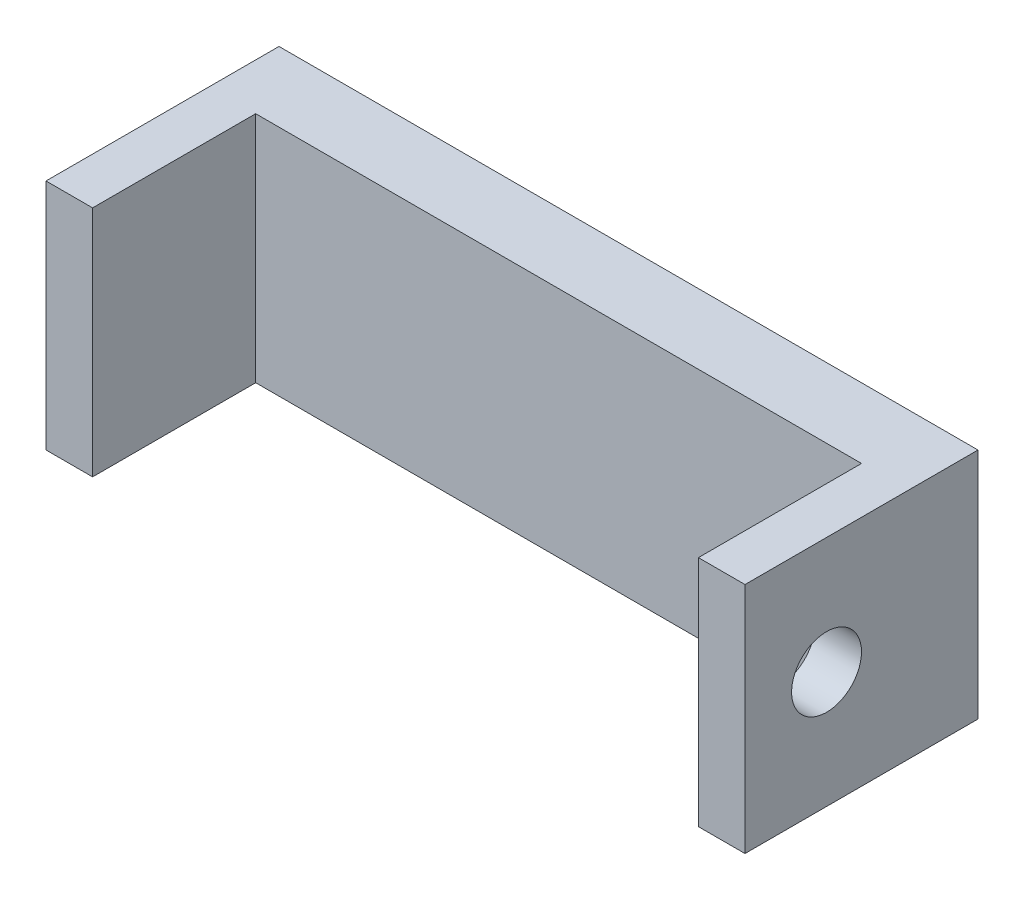
ISO-10303-21;
HEADER;
FILE_DESCRIPTION(('STEP AP214'),'2;1');
FILE_NAME('part.step','',(''),(''),'','','');
FILE_SCHEMA(('AUTOMOTIVE_DESIGN { 1 0 10303 214 1 1 1 1 }'));
ENDSEC;
DATA;
#1=APPLICATION_CONTEXT('core data for automotive mechanical design processes');
#2=APPLICATION_PROTOCOL_DEFINITION('international standard','automotive_design',2000,#1);
#3=PRODUCT_CONTEXT('',#1,'mechanical');
#4=PRODUCT('Part','Part','',(#3));
#5=PRODUCT_RELATED_PRODUCT_CATEGORY('part','',(#4));
#6=PRODUCT_DEFINITION_FORMATION('','',#4);
#7=PRODUCT_DEFINITION_CONTEXT('part definition',#1,'design');
#8=PRODUCT_DEFINITION('design','',#6,#7);
#9=PRODUCT_DEFINITION_SHAPE('','',#8);
#10=(LENGTH_UNIT() NAMED_UNIT(*) SI_UNIT(.MILLI.,.METRE.));
#11=(NAMED_UNIT(*) PLANE_ANGLE_UNIT() SI_UNIT($,.RADIAN.));
#12=(NAMED_UNIT(*) SI_UNIT($,.STERADIAN.) SOLID_ANGLE_UNIT());
#13=UNCERTAINTY_MEASURE_WITH_UNIT(LENGTH_MEASURE(1.E-05),#10,'distance_accuracy_value','');
#14=(GEOMETRIC_REPRESENTATION_CONTEXT(3) GLOBAL_UNCERTAINTY_ASSIGNED_CONTEXT((#13)) GLOBAL_UNIT_ASSIGNED_CONTEXT((#10,
#11,#12)) REPRESENTATION_CONTEXT('',''));
#15=CARTESIAN_POINT('',(0.,0.,0.));
#16=DIRECTION('',(0.,0.,1.));
#17=DIRECTION('',(1.,0.,0.));
#18=AXIS2_PLACEMENT_3D('',#15,#16,#17);
#19=CARTESIAN_POINT('',(0.,0.,1.5));
#20=DIRECTION('',(0.,0.,1.));
#21=DIRECTION('',(1.,0.,0.));
#22=AXIS2_PLACEMENT_3D('',#19,#20,#21);
#23=PLANE('',#22);
#24=DIRECTION('',(1.,0.,0.));
#25=VECTOR('',#24,1.);
#26=CARTESIAN_POINT('',(-15.,-5.,1.5));
#27=LINE('',#26,#25);
#28=CARTESIAN_POINT('',(-13.,-5.,1.5));
#29=VERTEX_POINT('',#28);
#30=CARTESIAN_POINT('',(13.,-5.,1.5));
#31=VERTEX_POINT('',#30);
#32=EDGE_CURVE('E61',#29,#31,#27,.T.);
#33=ORIENTED_EDGE('',*,*,#32,.T.);
#34=DIRECTION('',(0.,-1.,0.));
#35=VECTOR('',#34,1.);
#36=CARTESIAN_POINT('',(13.,5.,1.5));
#37=LINE('',#36,#35);
#38=CARTESIAN_POINT('',(13.,5.,1.5));
#39=VERTEX_POINT('',#38);
#40=EDGE_CURVE('E56',#39,#31,#37,.T.);
#41=ORIENTED_EDGE('',*,*,#40,.F.);
#42=DIRECTION('',(-1.,0.,0.));
#43=VECTOR('',#42,1.);
#44=CARTESIAN_POINT('',(-15.,5.,1.5));
#45=LINE('',#44,#43);
#46=CARTESIAN_POINT('',(-13.,5.,1.5));
#47=VERTEX_POINT('',#46);
#48=EDGE_CURVE('E155',#39,#47,#45,.T.);
#49=ORIENTED_EDGE('',*,*,#48,.T.);
#50=DIRECTION('',(0.,1.,0.));
#51=VECTOR('',#50,1.);
#52=CARTESIAN_POINT('',(-13.,5.,1.5));
#53=LINE('',#52,#51);
#54=EDGE_CURVE('E130',#29,#47,#53,.T.);
#55=ORIENTED_EDGE('',*,*,#54,.F.);
#56=EDGE_LOOP('',(#33,#41,#49,#55));
#57=FACE_BOUND('',#56,.T.);
#58=ADVANCED_FACE('F41',(#57),#23,.T.);
#59=CARTESIAN_POINT('',(15.,5.,1.5));
#60=DIRECTION('',(-1.,0.,0.));
#61=DIRECTION('',(0.,0.,1.));
#62=AXIS2_PLACEMENT_3D('',#59,#60,#61);
#63=PLANE('',#62);
#64=CARTESIAN_POINT('',(15.,0.,5.));
#65=DIRECTION('',(1.,0.,0.));
#66=DIRECTION('',(0.,0.,-1.));
#67=AXIS2_PLACEMENT_3D('',#64,#65,#66);
#68=CIRCLE('',#67,1.5);
#69=CARTESIAN_POINT('',(15.,0.,3.5));
#70=VERTEX_POINT('',#69);
#71=EDGE_CURVE('E177',#70,#70,#68,.T.);
#72=ORIENTED_EDGE('',*,*,#71,.F.);
#73=EDGE_LOOP('',(#72));
#74=FACE_BOUND('',#73,.T.);
#75=DIRECTION('',(0.,1.,0.));
#76=VECTOR('',#75,1.);
#77=CARTESIAN_POINT('',(15.,5.,-1.5));
#78=LINE('',#77,#76);
#79=CARTESIAN_POINT('',(15.,-5.,-1.5));
#80=VERTEX_POINT('',#79);
#81=CARTESIAN_POINT('',(15.,5.,-1.5));
#82=VERTEX_POINT('',#81);
#83=EDGE_CURVE('E154',#80,#82,#78,.T.);
#84=ORIENTED_EDGE('',*,*,#83,.T.);
#85=DIRECTION('',(0.,0.,-1.));
#86=VECTOR('',#85,1.);
#87=CARTESIAN_POINT('',(15.,5.,1.5));
#88=LINE('',#87,#86);
#89=CARTESIAN_POINT('',(15.,5.,8.5));
#90=VERTEX_POINT('',#89);
#91=EDGE_CURVE('E11',#90,#82,#88,.T.);
#92=ORIENTED_EDGE('',*,*,#91,.F.);
#93=DIRECTION('',(0.,1.,0.));
#94=VECTOR('',#93,1.);
#95=CARTESIAN_POINT('',(15.,5.,8.5));
#96=LINE('',#95,#94);
#97=CARTESIAN_POINT('',(15.,-5.,8.5));
#98=VERTEX_POINT('',#97);
#99=EDGE_CURVE('E121',#98,#90,#96,.T.);
#100=ORIENTED_EDGE('',*,*,#99,.F.);
#101=DIRECTION('',(0.,0.,-1.));
#102=VECTOR('',#101,1.);
#103=CARTESIAN_POINT('',(15.,-5.,1.5));
#104=LINE('',#103,#102);
#105=EDGE_CURVE('E104',#98,#80,#104,.T.);
#106=ORIENTED_EDGE('',*,*,#105,.T.);
#107=EDGE_LOOP('',(#84,#92,#100,#106));
#108=FACE_BOUND('',#107,.T.);
#109=ADVANCED_FACE('F43',(#74,#108),#63,.F.);
#110=CARTESIAN_POINT('',(-15.,5.,1.5));
#111=DIRECTION('',(0.,-1.,0.));
#112=DIRECTION('',(0.,0.,-1.));
#113=AXIS2_PLACEMENT_3D('',#110,#111,#112);
#114=PLANE('',#113);
#115=DIRECTION('',(-1.,0.,0.));
#116=VECTOR('',#115,1.);
#117=CARTESIAN_POINT('',(-15.,5.,-1.5));
#118=LINE('',#117,#116);
#119=CARTESIAN_POINT('',(-15.,5.,-1.5));
#120=VERTEX_POINT('',#119);
#121=EDGE_CURVE('E159',#82,#120,#118,.T.);
#122=ORIENTED_EDGE('',*,*,#121,.T.);
#123=DIRECTION('',(0.,0.,-1.));
#124=VECTOR('',#123,1.);
#125=CARTESIAN_POINT('',(-15.,5.,1.5));
#126=LINE('',#125,#124);
#127=CARTESIAN_POINT('',(-15.,5.,8.5));
#128=VERTEX_POINT('',#127);
#129=EDGE_CURVE('E49',#128,#120,#126,.T.);
#130=ORIENTED_EDGE('',*,*,#129,.F.);
#131=DIRECTION('',(-1.,0.,0.));
#132=VECTOR('',#131,1.);
#133=CARTESIAN_POINT('',(-15.,5.,8.5));
#134=LINE('',#133,#132);
#135=CARTESIAN_POINT('',(-13.,5.,8.5));
#136=VERTEX_POINT('',#135);
#137=EDGE_CURVE('E138',#136,#128,#134,.T.);
#138=ORIENTED_EDGE('',*,*,#137,.F.);
#139=DIRECTION('',(0.,0.,-1.));
#140=VECTOR('',#139,1.);
#141=CARTESIAN_POINT('',(-13.,5.,8.5));
#142=LINE('',#141,#140);
#143=EDGE_CURVE('E151',#136,#47,#142,.T.);
#144=ORIENTED_EDGE('',*,*,#143,.T.);
#145=ORIENTED_EDGE('',*,*,#48,.F.);
#146=DIRECTION('',(0.,0.,-1.));
#147=VECTOR('',#146,1.);
#148=CARTESIAN_POINT('',(13.,5.,8.5));
#149=LINE('',#148,#147);
#150=CARTESIAN_POINT('',(13.,5.,8.5));
#151=VERTEX_POINT('',#150);
#152=EDGE_CURVE('E175',#151,#39,#149,.T.);
#153=ORIENTED_EDGE('',*,*,#152,.F.);
#154=DIRECTION('',(-1.,0.,0.));
#155=VECTOR('',#154,1.);
#156=CARTESIAN_POINT('',(13.,5.,8.5));
#157=LINE('',#156,#155);
#158=EDGE_CURVE('E128',#90,#151,#157,.T.);
#159=ORIENTED_EDGE('',*,*,#158,.F.);
#160=ORIENTED_EDGE('',*,*,#91,.T.);
#161=EDGE_LOOP('',(#122,#130,#138,#144,#145,#153,#159,#160));
#162=FACE_BOUND('',#161,.T.);
#163=ADVANCED_FACE('F172',(#162),#114,.F.);
#164=CARTESIAN_POINT('',(-15.,5.,1.5));
#165=DIRECTION('',(1.,0.,0.));
#166=DIRECTION('',(0.,0.,-1.));
#167=AXIS2_PLACEMENT_3D('',#164,#165,#166);
#168=PLANE('',#167);
#169=DIRECTION('',(0.,-1.,0.));
#170=VECTOR('',#169,1.);
#171=CARTESIAN_POINT('',(-15.,5.,-1.5));
#172=LINE('',#171,#170);
#173=CARTESIAN_POINT('',(-15.,-5.,-1.5));
#174=VERTEX_POINT('',#173);
#175=EDGE_CURVE('E161',#120,#174,#172,.T.);
#176=ORIENTED_EDGE('',*,*,#175,.T.);
#177=DIRECTION('',(0.,0.,-1.));
#178=VECTOR('',#177,1.);
#179=CARTESIAN_POINT('',(-15.,-5.,1.5));
#180=LINE('',#179,#178);
#181=CARTESIAN_POINT('',(-15.,-5.,8.5));
#182=VERTEX_POINT('',#181);
#183=EDGE_CURVE('E116',#182,#174,#180,.T.);
#184=ORIENTED_EDGE('',*,*,#183,.F.);
#185=DIRECTION('',(0.,-1.,0.));
#186=VECTOR('',#185,1.);
#187=CARTESIAN_POINT('',(-15.,5.,8.5));
#188=LINE('',#187,#186);
#189=EDGE_CURVE('E141',#128,#182,#188,.T.);
#190=ORIENTED_EDGE('',*,*,#189,.F.);
#191=ORIENTED_EDGE('',*,*,#129,.T.);
#192=EDGE_LOOP('',(#176,#184,#190,#191));
#193=FACE_BOUND('',#192,.T.);
#194=ADVANCED_FACE('F168',(#193),#168,.F.);
#195=CARTESIAN_POINT('',(-15.,-5.,1.5));
#196=DIRECTION('',(0.,1.,0.));
#197=DIRECTION('',(0.,0.,1.));
#198=AXIS2_PLACEMENT_3D('',#195,#196,#197);
#199=PLANE('',#198);
#200=DIRECTION('',(1.,0.,0.));
#201=VECTOR('',#200,1.);
#202=CARTESIAN_POINT('',(-15.,-5.,-1.5));
#203=LINE('',#202,#201);
#204=EDGE_CURVE('E111',#174,#80,#203,.T.);
#205=ORIENTED_EDGE('',*,*,#204,.T.);
#206=ORIENTED_EDGE('',*,*,#105,.F.);
#207=DIRECTION('',(1.,0.,0.));
#208=VECTOR('',#207,1.);
#209=CARTESIAN_POINT('',(13.,-5.,8.5));
#210=LINE('',#209,#208);
#211=CARTESIAN_POINT('',(13.,-5.,8.5));
#212=VERTEX_POINT('',#211);
#213=EDGE_CURVE('E108',#212,#98,#210,.T.);
#214=ORIENTED_EDGE('',*,*,#213,.F.);
#215=DIRECTION('',(0.,0.,-1.));
#216=VECTOR('',#215,1.);
#217=CARTESIAN_POINT('',(13.,-5.,8.5));
#218=LINE('',#217,#216);
#219=EDGE_CURVE('E125',#212,#31,#218,.T.);
#220=ORIENTED_EDGE('',*,*,#219,.T.);
#221=ORIENTED_EDGE('',*,*,#32,.F.);
#222=DIRECTION('',(0.,0.,-1.));
#223=VECTOR('',#222,1.);
#224=CARTESIAN_POINT('',(-13.,-5.,8.5));
#225=LINE('',#224,#223);
#226=CARTESIAN_POINT('',(-13.,-5.,8.5));
#227=VERTEX_POINT('',#226);
#228=EDGE_CURVE('E146',#227,#29,#225,.T.);
#229=ORIENTED_EDGE('',*,*,#228,.F.);
#230=DIRECTION('',(1.,0.,0.));
#231=VECTOR('',#230,1.);
#232=CARTESIAN_POINT('',(-15.,-5.,8.5));
#233=LINE('',#232,#231);
#234=EDGE_CURVE('E144',#182,#227,#233,.T.);
#235=ORIENTED_EDGE('',*,*,#234,.F.);
#236=ORIENTED_EDGE('',*,*,#183,.T.);
#237=EDGE_LOOP('',(#205,#206,#214,#220,#221,#229,#235,#236));
#238=FACE_BOUND('',#237,.T.);
#239=ADVANCED_FACE('F106',(#238),#199,.F.);
#240=CARTESIAN_POINT('',(0.,0.,-1.5));
#241=DIRECTION('',(0.,0.,1.));
#242=DIRECTION('',(1.,0.,0.));
#243=AXIS2_PLACEMENT_3D('',#240,#241,#242);
#244=PLANE('',#243);
#245=ORIENTED_EDGE('',*,*,#83,.F.);
#246=ORIENTED_EDGE('',*,*,#204,.F.);
#247=ORIENTED_EDGE('',*,*,#175,.F.);
#248=ORIENTED_EDGE('',*,*,#121,.F.);
#249=EDGE_LOOP('',(#245,#246,#247,#248));
#250=FACE_BOUND('',#249,.T.);
#251=ADVANCED_FACE('F171',(#250),#244,.F.);
#252=CARTESIAN_POINT('',(-13.,5.,8.5));
#253=DIRECTION('',(-1.,0.,0.));
#254=DIRECTION('',(0.,-1.,0.));
#255=AXIS2_PLACEMENT_3D('',#252,#253,#254);
#256=PLANE('',#255);
#257=ORIENTED_EDGE('',*,*,#54,.T.);
#258=ORIENTED_EDGE('',*,*,#143,.F.);
#259=DIRECTION('',(0.,1.,0.));
#260=VECTOR('',#259,1.);
#261=CARTESIAN_POINT('',(-13.,5.,8.5));
#262=LINE('',#261,#260);
#263=EDGE_CURVE('E135',#227,#136,#262,.T.);
#264=ORIENTED_EDGE('',*,*,#263,.F.);
#265=ORIENTED_EDGE('',*,*,#228,.T.);
#266=EDGE_LOOP('',(#257,#258,#264,#265));
#267=FACE_BOUND('',#266,.T.);
#268=ADVANCED_FACE('F198',(#267),#256,.F.);
#269=CARTESIAN_POINT('',(0.,0.,8.5));
#270=DIRECTION('',(0.,0.,1.));
#271=DIRECTION('',(1.,0.,0.));
#272=AXIS2_PLACEMENT_3D('',#269,#270,#271);
#273=PLANE('',#272);
#274=ORIENTED_EDGE('',*,*,#263,.T.);
#275=ORIENTED_EDGE('',*,*,#137,.T.);
#276=ORIENTED_EDGE('',*,*,#189,.T.);
#277=ORIENTED_EDGE('',*,*,#234,.T.);
#278=EDGE_LOOP('',(#274,#275,#276,#277));
#279=FACE_BOUND('',#278,.T.);
#280=ADVANCED_FACE('F191',(#279),#273,.T.);
#281=CARTESIAN_POINT('',(13.,5.,8.5));
#282=DIRECTION('',(1.,0.,0.));
#283=DIRECTION('',(0.,0.,-1.));
#284=AXIS2_PLACEMENT_3D('',#281,#282,#283);
#285=PLANE('',#284);
#286=CARTESIAN_POINT('',(13.,0.,5.));
#287=DIRECTION('',(1.,0.,0.));
#288=DIRECTION('',(0.,0.,-1.));
#289=AXIS2_PLACEMENT_3D('',#286,#287,#288);
#290=CIRCLE('',#289,1.5);
#291=CARTESIAN_POINT('',(13.,0.,3.5));
#292=VERTEX_POINT('',#291);
#293=EDGE_CURVE('E184',#292,#292,#290,.F.);
#294=ORIENTED_EDGE('',*,*,#293,.F.);
#295=EDGE_LOOP('',(#294));
#296=FACE_BOUND('',#295,.T.);
#297=ORIENTED_EDGE('',*,*,#40,.T.);
#298=ORIENTED_EDGE('',*,*,#219,.F.);
#299=DIRECTION('',(0.,-1.,0.));
#300=VECTOR('',#299,1.);
#301=CARTESIAN_POINT('',(13.,5.,8.5));
#302=LINE('',#301,#300);
#303=EDGE_CURVE('E123',#151,#212,#302,.T.);
#304=ORIENTED_EDGE('',*,*,#303,.F.);
#305=ORIENTED_EDGE('',*,*,#152,.T.);
#306=EDGE_LOOP('',(#297,#298,#304,#305));
#307=FACE_BOUND('',#306,.T.);
#308=ADVANCED_FACE('F179',(#296,#307),#285,.F.);
#309=CARTESIAN_POINT('',(0.,0.,8.5));
#310=DIRECTION('',(0.,0.,1.));
#311=DIRECTION('',(1.,0.,0.));
#312=AXIS2_PLACEMENT_3D('',#309,#310,#311);
#313=PLANE('',#312);
#314=ORIENTED_EDGE('',*,*,#99,.T.);
#315=ORIENTED_EDGE('',*,*,#158,.T.);
#316=ORIENTED_EDGE('',*,*,#303,.T.);
#317=ORIENTED_EDGE('',*,*,#213,.T.);
#318=EDGE_LOOP('',(#314,#315,#316,#317));
#319=FACE_BOUND('',#318,.T.);
#320=ADVANCED_FACE('F120',(#319),#313,.T.);
#321=CARTESIAN_POINT('',(-15.001,0.,5.));
#322=DIRECTION('',(1.,0.,0.));
#323=DIRECTION('',(0.,0.,-1.));
#324=AXIS2_PLACEMENT_3D('',#321,#322,#323);
#325=CYLINDRICAL_SURFACE('',#324,1.5);
#326=ORIENTED_EDGE('',*,*,#71,.T.);
#327=EDGE_LOOP('',(#326));
#328=FACE_BOUND('',#327,.T.);
#329=ORIENTED_EDGE('',*,*,#293,.T.);
#330=EDGE_LOOP('',(#329));
#331=FACE_BOUND('',#330,.T.);
#332=ADVANCED_FACE('F188',(#328,#331),#325,.F.);
#333=CLOSED_SHELL('',(#58,#109,#163,#194,#239,#251,#268,#280,#308,#320,#332));
#334=MANIFOLD_SOLID_BREP('B2',#333);
#335=ADVANCED_BREP_SHAPE_REPRESENTATION('',(#18,#334),#14);
#336=SHAPE_DEFINITION_REPRESENTATION(#9,#335);
ENDSEC;
END-ISO-10303-21;
